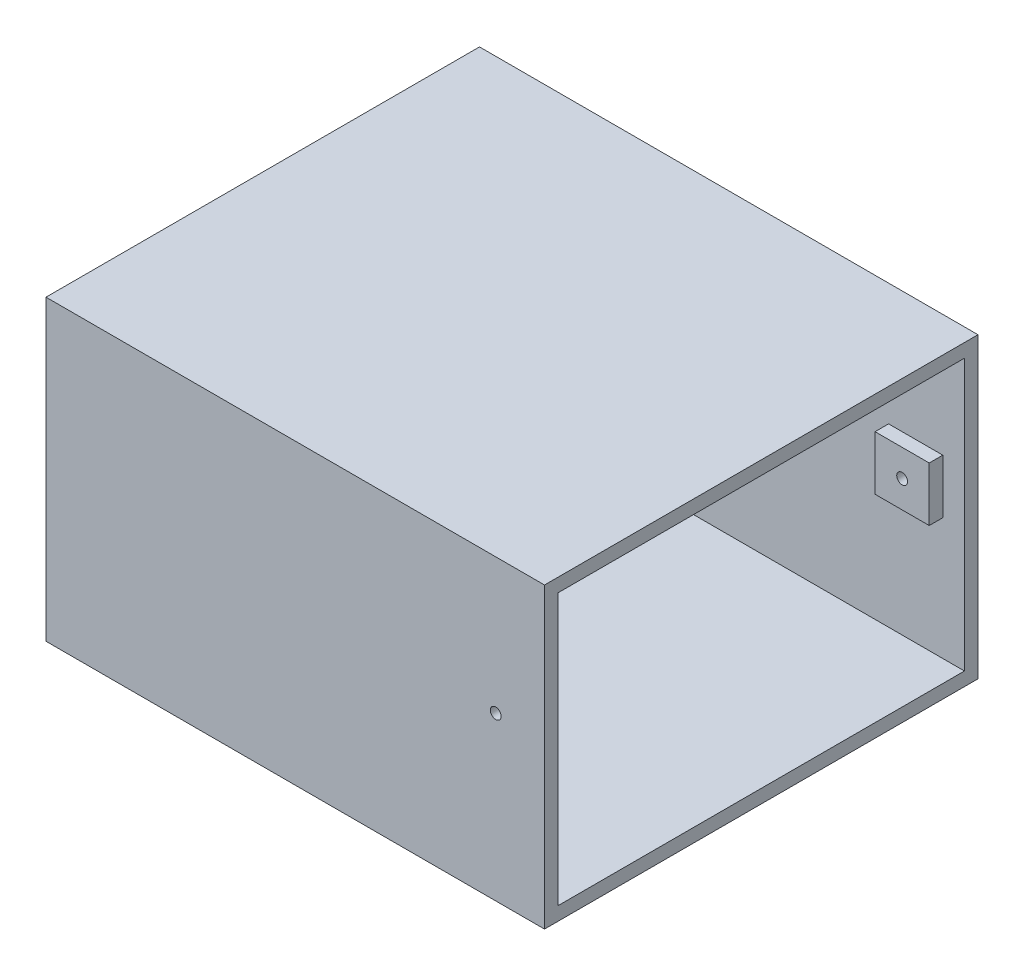
ISO-10303-21;
HEADER;
FILE_DESCRIPTION(('STEP AP214'),'2;1');
FILE_NAME('part.step','',(''),(''),'','','');
FILE_SCHEMA(('AUTOMOTIVE_DESIGN { 1 0 10303 214 1 1 1 1 }'));
ENDSEC;
DATA;
#1=APPLICATION_CONTEXT('core data for automotive mechanical design processes');
#2=APPLICATION_PROTOCOL_DEFINITION('international standard','automotive_design',2000,#1);
#3=PRODUCT_CONTEXT('',#1,'mechanical');
#4=PRODUCT('Part','Part','',(#3));
#5=PRODUCT_RELATED_PRODUCT_CATEGORY('part','',(#4));
#6=PRODUCT_DEFINITION_FORMATION('','',#4);
#7=PRODUCT_DEFINITION_CONTEXT('part definition',#1,'design');
#8=PRODUCT_DEFINITION('design','',#6,#7);
#9=PRODUCT_DEFINITION_SHAPE('','',#8);
#10=(LENGTH_UNIT() NAMED_UNIT(*) SI_UNIT(.MILLI.,.METRE.));
#11=(NAMED_UNIT(*) PLANE_ANGLE_UNIT() SI_UNIT($,.RADIAN.));
#12=(NAMED_UNIT(*) SI_UNIT($,.STERADIAN.) SOLID_ANGLE_UNIT());
#13=UNCERTAINTY_MEASURE_WITH_UNIT(LENGTH_MEASURE(1.E-05),#10,'distance_accuracy_value','');
#14=(GEOMETRIC_REPRESENTATION_CONTEXT(3) GLOBAL_UNCERTAINTY_ASSIGNED_CONTEXT((#13)) GLOBAL_UNIT_ASSIGNED_CONTEXT((#10,
#11,#12)) REPRESENTATION_CONTEXT('',''));
#15=CARTESIAN_POINT('',(0.,0.,0.));
#16=DIRECTION('',(0.,0.,1.));
#17=DIRECTION('',(1.,0.,0.));
#18=AXIS2_PLACEMENT_3D('',#15,#16,#17);
#19=CARTESIAN_POINT('',(-89.5,-25.,37.5));
#20=DIRECTION('',(0.,0.,1.));
#21=DIRECTION('',(1.,0.,0.));
#22=AXIS2_PLACEMENT_3D('',#19,#20,#21);
#23=PLANE('',#22);
#24=DIRECTION('',(0.,-1.,0.));
#25=VECTOR('',#24,1.);
#26=CARTESIAN_POINT('',(0.,-25.,37.5));
#27=LINE('',#26,#25);
#28=CARTESIAN_POINT('',(0.,25.,37.5));
#29=VERTEX_POINT('',#28);
#30=CARTESIAN_POINT('',(0.,-25.,37.5));
#31=VERTEX_POINT('',#30);
#32=EDGE_CURVE('E305',#29,#31,#27,.T.);
#33=ORIENTED_EDGE('',*,*,#32,.T.);
#34=DIRECTION('',(1.,0.,0.));
#35=VECTOR('',#34,1.);
#36=CARTESIAN_POINT('',(-89.5,-25.,37.5));
#37=LINE('',#36,#35);
#38=CARTESIAN_POINT('',(-89.5,-25.,37.5));
#39=VERTEX_POINT('',#38);
#40=EDGE_CURVE('E314',#39,#31,#37,.T.);
#41=ORIENTED_EDGE('',*,*,#40,.F.);
#42=DIRECTION('',(0.,-1.,0.));
#43=VECTOR('',#42,1.);
#44=CARTESIAN_POINT('',(-89.5,-25.,37.5));
#45=LINE('',#44,#43);
#46=CARTESIAN_POINT('',(-89.5,25.,37.5));
#47=VERTEX_POINT('',#46);
#48=EDGE_CURVE('E294',#47,#39,#45,.T.);
#49=ORIENTED_EDGE('',*,*,#48,.F.);
#50=DIRECTION('',(1.,0.,0.));
#51=VECTOR('',#50,1.);
#52=CARTESIAN_POINT('',(-89.5,25.,37.5));
#53=LINE('',#52,#51);
#54=EDGE_CURVE('E316',#47,#29,#53,.T.);
#55=ORIENTED_EDGE('',*,*,#54,.T.);
#56=EDGE_LOOP('',(#33,#41,#49,#55));
#57=FACE_BOUND('',#56,.T.);
#58=DIRECTION('',(0.,1.,0.));
#59=VECTOR('',#58,1.);
#60=CARTESIAN_POINT('',(-14.,-2.50000000000001,37.5));
#61=LINE('',#60,#59);
#62=CARTESIAN_POINT('',(-14.,-2.50000000000001,37.5));
#63=VERTEX_POINT('',#62);
#64=CARTESIAN_POINT('',(-14.,7.49999999999999,37.5));
#65=VERTEX_POINT('',#64);
#66=EDGE_CURVE('E223',#63,#65,#61,.T.);
#67=ORIENTED_EDGE('',*,*,#66,.F.);
#68=DIRECTION('',(-1.,0.,0.));
#69=VECTOR('',#68,1.);
#70=CARTESIAN_POINT('',(-4.,-2.50000000000001,37.5));
#71=LINE('',#70,#69);
#72=CARTESIAN_POINT('',(-4.,-2.50000000000001,37.5));
#73=VERTEX_POINT('',#72);
#74=EDGE_CURVE('E228',#73,#63,#71,.T.);
#75=ORIENTED_EDGE('',*,*,#74,.F.);
#76=DIRECTION('',(0.,-1.,0.));
#77=VECTOR('',#76,1.);
#78=CARTESIAN_POINT('',(-4.,-2.50000000000001,37.5));
#79=LINE('',#78,#77);
#80=CARTESIAN_POINT('',(-4.,7.49999999999999,37.5));
#81=VERTEX_POINT('',#80);
#82=EDGE_CURVE('E238',#81,#73,#79,.T.);
#83=ORIENTED_EDGE('',*,*,#82,.F.);
#84=DIRECTION('',(1.,0.,0.));
#85=VECTOR('',#84,1.);
#86=CARTESIAN_POINT('',(-4.,7.49999999999999,37.5));
#87=LINE('',#86,#85);
#88=EDGE_CURVE('E65',#65,#81,#87,.T.);
#89=ORIENTED_EDGE('',*,*,#88,.F.);
#90=EDGE_LOOP('',(#67,#75,#83,#89));
#91=FACE_BOUND('',#90,.T.);
#92=ADVANCED_FACE('F40',(#57,#91),#23,.F.);
#93=CARTESIAN_POINT('',(-89.5,0.,0.));
#94=DIRECTION('',(-1.,0.,0.));
#95=DIRECTION('',(0.,0.,1.));
#96=AXIS2_PLACEMENT_3D('',#93,#94,#95);
#97=PLANE('',#96);
#98=DIRECTION('',(0.,0.,1.));
#99=VECTOR('',#98,1.);
#100=CARTESIAN_POINT('',(-89.5,16.5,-37.5));
#101=LINE('',#100,#99);
#102=CARTESIAN_POINT('',(-89.5,16.5,-37.5));
#103=VERTEX_POINT('',#102);
#104=CARTESIAN_POINT('',(-89.5,16.5,-2.5));
#105=VERTEX_POINT('',#104);
#106=EDGE_CURVE('E263',#103,#105,#101,.T.);
#107=ORIENTED_EDGE('',*,*,#106,.F.);
#108=DIRECTION('',(0.,1.,0.));
#109=VECTOR('',#108,1.);
#110=CARTESIAN_POINT('',(-89.5,-25.,-37.5));
#111=LINE('',#110,#109);
#112=CARTESIAN_POINT('',(-89.5,25.,-37.5));
#113=VERTEX_POINT('',#112);
#114=EDGE_CURVE('E291',#103,#113,#111,.T.);
#115=ORIENTED_EDGE('',*,*,#114,.T.);
#116=DIRECTION('',(0.,0.,1.));
#117=VECTOR('',#116,1.);
#118=CARTESIAN_POINT('',(-89.5,25.,37.5));
#119=LINE('',#118,#117);
#120=EDGE_CURVE('E290',#113,#47,#119,.T.);
#121=ORIENTED_EDGE('',*,*,#120,.T.);
#122=ORIENTED_EDGE('',*,*,#48,.T.);
#123=DIRECTION('',(0.,0.,-1.));
#124=VECTOR('',#123,1.);
#125=CARTESIAN_POINT('',(-89.5,-25.,37.5));
#126=LINE('',#125,#124);
#127=CARTESIAN_POINT('',(-89.5,-25.,-37.5));
#128=VERTEX_POINT('',#127);
#129=EDGE_CURVE('E297',#39,#128,#126,.T.);
#130=ORIENTED_EDGE('',*,*,#129,.T.);
#131=CARTESIAN_POINT('',(-89.5,1.5,-37.5));
#132=VERTEX_POINT('',#131);
#133=EDGE_CURVE('E287',#128,#132,#111,.T.);
#134=ORIENTED_EDGE('',*,*,#133,.T.);
#135=DIRECTION('',(0.,0.,-1.));
#136=VECTOR('',#135,1.);
#137=CARTESIAN_POINT('',(-89.5,1.5,-37.5));
#138=LINE('',#137,#136);
#139=CARTESIAN_POINT('',(-89.5,1.5,-2.5));
#140=VERTEX_POINT('',#139);
#141=EDGE_CURVE('E266',#140,#132,#138,.T.);
#142=ORIENTED_EDGE('',*,*,#141,.F.);
#143=DIRECTION('',(0.,-1.,0.));
#144=VECTOR('',#143,1.);
#145=CARTESIAN_POINT('',(-89.5,16.5,-2.5));
#146=LINE('',#145,#144);
#147=EDGE_CURVE('E260',#105,#140,#146,.T.);
#148=ORIENTED_EDGE('',*,*,#147,.F.);
#149=EDGE_LOOP('',(#107,#115,#121,#122,#130,#134,#142,#148));
#150=FACE_BOUND('',#149,.T.);
#151=ADVANCED_FACE('F373',(#150),#97,.F.);
#152=CARTESIAN_POINT('',(-92.,-27.5,-40.));
#153=DIRECTION('',(0.,0.,-1.));
#154=DIRECTION('',(-1.,0.,0.));
#155=AXIS2_PLACEMENT_3D('',#152,#153,#154);
#156=PLANE('',#155);
#157=CARTESIAN_POINT('',(-9.,2.5,-40.));
#158=DIRECTION('',(0.,0.,1.));
#159=DIRECTION('',(1.,0.,0.));
#160=AXIS2_PLACEMENT_3D('',#157,#158,#159);
#161=CIRCLE('',#160,1.);
#162=CARTESIAN_POINT('',(-8.,2.5,-40.));
#163=VERTEX_POINT('',#162);
#164=EDGE_CURVE('E254',#163,#163,#161,.T.);
#165=ORIENTED_EDGE('',*,*,#164,.T.);
#166=EDGE_LOOP('',(#165));
#167=FACE_BOUND('',#166,.T.);
#168=DIRECTION('',(0.,1.,0.));
#169=VECTOR('',#168,1.);
#170=CARTESIAN_POINT('',(0.,-27.5,-40.));
#171=LINE('',#170,#169);
#172=CARTESIAN_POINT('',(0.,-27.5,-40.));
#173=VERTEX_POINT('',#172);
#174=CARTESIAN_POINT('',(0.,27.5,-40.));
#175=VERTEX_POINT('',#174);
#176=EDGE_CURVE('E313',#173,#175,#171,.T.);
#177=ORIENTED_EDGE('',*,*,#176,.F.);
#178=DIRECTION('',(1.,0.,0.));
#179=VECTOR('',#178,1.);
#180=CARTESIAN_POINT('',(-92.,-27.5,-40.));
#181=LINE('',#180,#179);
#182=CARTESIAN_POINT('',(-92.,-27.5,-40.));
#183=VERTEX_POINT('',#182);
#184=EDGE_CURVE('E11',#183,#173,#181,.T.);
#185=ORIENTED_EDGE('',*,*,#184,.F.);
#186=DIRECTION('',(0.,1.,0.));
#187=VECTOR('',#186,1.);
#188=CARTESIAN_POINT('',(-92.,-27.5,-40.));
#189=LINE('',#188,#187);
#190=CARTESIAN_POINT('',(-92.,27.5,-40.));
#191=VERTEX_POINT('',#190);
#192=EDGE_CURVE('E320',#183,#191,#189,.T.);
#193=ORIENTED_EDGE('',*,*,#192,.T.);
#194=DIRECTION('',(1.,0.,0.));
#195=VECTOR('',#194,1.);
#196=CARTESIAN_POINT('',(-92.,27.5,-40.));
#197=LINE('',#196,#195);
#198=EDGE_CURVE('E44',#191,#175,#197,.T.);
#199=ORIENTED_EDGE('',*,*,#198,.T.);
#200=EDGE_LOOP('',(#177,#185,#193,#199));
#201=FACE_BOUND('',#200,.T.);
#202=ADVANCED_FACE('F42',(#167,#201),#156,.T.);
#203=CARTESIAN_POINT('',(-92.,-27.5,40.));
#204=DIRECTION('',(0.,-1.,0.));
#205=DIRECTION('',(0.,0.,-1.));
#206=AXIS2_PLACEMENT_3D('',#203,#204,#205);
#207=PLANE('',#206);
#208=DIRECTION('',(0.,0.,-1.));
#209=VECTOR('',#208,1.);
#210=CARTESIAN_POINT('',(0.,-27.5,40.));
#211=LINE('',#210,#209);
#212=CARTESIAN_POINT('',(0.,-27.5,40.));
#213=VERTEX_POINT('',#212);
#214=EDGE_CURVE('E324',#213,#173,#211,.T.);
#215=ORIENTED_EDGE('',*,*,#214,.F.);
#216=DIRECTION('',(1.,0.,0.));
#217=VECTOR('',#216,1.);
#218=CARTESIAN_POINT('',(-92.,-27.5,40.));
#219=LINE('',#218,#217);
#220=CARTESIAN_POINT('',(-92.,-27.5,40.));
#221=VERTEX_POINT('',#220);
#222=EDGE_CURVE('E49',#221,#213,#219,.T.);
#223=ORIENTED_EDGE('',*,*,#222,.F.);
#224=DIRECTION('',(0.,0.,-1.));
#225=VECTOR('',#224,1.);
#226=CARTESIAN_POINT('',(-92.,-27.5,40.));
#227=LINE('',#226,#225);
#228=EDGE_CURVE('E330',#221,#183,#227,.T.);
#229=ORIENTED_EDGE('',*,*,#228,.T.);
#230=ORIENTED_EDGE('',*,*,#184,.T.);
#231=EDGE_LOOP('',(#215,#223,#229,#230));
#232=FACE_BOUND('',#231,.T.);
#233=ADVANCED_FACE('F356',(#232),#207,.T.);
#234=CARTESIAN_POINT('',(-92.,-27.5,40.));
#235=DIRECTION('',(0.,0.,1.));
#236=DIRECTION('',(1.,0.,0.));
#237=AXIS2_PLACEMENT_3D('',#234,#235,#236);
#238=PLANE('',#237);
#239=CARTESIAN_POINT('',(-9.,2.5,40.));
#240=DIRECTION('',(0.,0.,1.));
#241=DIRECTION('',(1.,0.,0.));
#242=AXIS2_PLACEMENT_3D('',#239,#240,#241);
#243=CIRCLE('',#242,1.);
#244=CARTESIAN_POINT('',(-8.,2.5,40.));
#245=VERTEX_POINT('',#244);
#246=EDGE_CURVE('E253',#245,#245,#243,.T.);
#247=ORIENTED_EDGE('',*,*,#246,.F.);
#248=EDGE_LOOP('',(#247));
#249=FACE_BOUND('',#248,.T.);
#250=DIRECTION('',(0.,-1.,0.));
#251=VECTOR('',#250,1.);
#252=CARTESIAN_POINT('',(0.,-27.5,40.));
#253=LINE('',#252,#251);
#254=CARTESIAN_POINT('',(0.,27.5,40.));
#255=VERTEX_POINT('',#254);
#256=EDGE_CURVE('E338',#255,#213,#253,.T.);
#257=ORIENTED_EDGE('',*,*,#256,.F.);
#258=DIRECTION('',(1.,0.,0.));
#259=VECTOR('',#258,1.);
#260=CARTESIAN_POINT('',(-92.,27.5,40.));
#261=LINE('',#260,#259);
#262=CARTESIAN_POINT('',(-92.,27.5,40.));
#263=VERTEX_POINT('',#262);
#264=EDGE_CURVE('E343',#263,#255,#261,.T.);
#265=ORIENTED_EDGE('',*,*,#264,.F.);
#266=DIRECTION('',(0.,-1.,0.));
#267=VECTOR('',#266,1.);
#268=CARTESIAN_POINT('',(-92.,-27.5,40.));
#269=LINE('',#268,#267);
#270=EDGE_CURVE('E327',#263,#221,#269,.T.);
#271=ORIENTED_EDGE('',*,*,#270,.T.);
#272=ORIENTED_EDGE('',*,*,#222,.T.);
#273=EDGE_LOOP('',(#257,#265,#271,#272));
#274=FACE_BOUND('',#273,.T.);
#275=ADVANCED_FACE('F362',(#249,#274),#238,.T.);
#276=CARTESIAN_POINT('',(-92.,27.5,40.));
#277=DIRECTION('',(0.,1.,0.));
#278=DIRECTION('',(0.,0.,1.));
#279=AXIS2_PLACEMENT_3D('',#276,#277,#278);
#280=PLANE('',#279);
#281=DIRECTION('',(0.,0.,1.));
#282=VECTOR('',#281,1.);
#283=CARTESIAN_POINT('',(0.,27.5,40.));
#284=LINE('',#283,#282);
#285=EDGE_CURVE('E335',#175,#255,#284,.T.);
#286=ORIENTED_EDGE('',*,*,#285,.F.);
#287=ORIENTED_EDGE('',*,*,#198,.F.);
#288=DIRECTION('',(0.,0.,1.));
#289=VECTOR('',#288,1.);
#290=CARTESIAN_POINT('',(-92.,27.5,40.));
#291=LINE('',#290,#289);
#292=EDGE_CURVE('E323',#191,#263,#291,.T.);
#293=ORIENTED_EDGE('',*,*,#292,.T.);
#294=ORIENTED_EDGE('',*,*,#264,.T.);
#295=EDGE_LOOP('',(#286,#287,#293,#294));
#296=FACE_BOUND('',#295,.T.);
#297=ADVANCED_FACE('F351',(#296),#280,.T.);
#298=CARTESIAN_POINT('',(-92.,0.,0.));
#299=DIRECTION('',(-1.,0.,0.));
#300=DIRECTION('',(0.,0.,1.));
#301=AXIS2_PLACEMENT_3D('',#298,#299,#300);
#302=PLANE('',#301);
#303=DIRECTION('',(0.,-1.,0.));
#304=VECTOR('',#303,1.);
#305=CARTESIAN_POINT('',(-92.,16.5,-37.5));
#306=LINE('',#305,#304);
#307=CARTESIAN_POINT('',(-92.,16.5,-37.5));
#308=VERTEX_POINT('',#307);
#309=CARTESIAN_POINT('',(-92.,1.5,-37.5));
#310=VERTEX_POINT('',#309);
#311=EDGE_CURVE('E257',#308,#310,#306,.T.);
#312=ORIENTED_EDGE('',*,*,#311,.F.);
#313=DIRECTION('',(0.,0.,-1.));
#314=VECTOR('',#313,1.);
#315=CARTESIAN_POINT('',(-92.,16.5,-37.5));
#316=LINE('',#315,#314);
#317=CARTESIAN_POINT('',(-92.,16.5,-2.5));
#318=VERTEX_POINT('',#317);
#319=EDGE_CURVE('E274',#318,#308,#316,.T.);
#320=ORIENTED_EDGE('',*,*,#319,.F.);
#321=DIRECTION('',(0.,1.,0.));
#322=VECTOR('',#321,1.);
#323=CARTESIAN_POINT('',(-92.,16.5,-2.5));
#324=LINE('',#323,#322);
#325=CARTESIAN_POINT('',(-92.,1.5,-2.5));
#326=VERTEX_POINT('',#325);
#327=EDGE_CURVE('E271',#326,#318,#324,.T.);
#328=ORIENTED_EDGE('',*,*,#327,.F.);
#329=DIRECTION('',(0.,0.,1.));
#330=VECTOR('',#329,1.);
#331=CARTESIAN_POINT('',(-92.,1.5,-37.5));
#332=LINE('',#331,#330);
#333=EDGE_CURVE('E268',#310,#326,#332,.T.);
#334=ORIENTED_EDGE('',*,*,#333,.F.);
#335=EDGE_LOOP('',(#312,#320,#328,#334));
#336=FACE_BOUND('',#335,.T.);
#337=ORIENTED_EDGE('',*,*,#192,.F.);
#338=ORIENTED_EDGE('',*,*,#228,.F.);
#339=ORIENTED_EDGE('',*,*,#270,.F.);
#340=ORIENTED_EDGE('',*,*,#292,.F.);
#341=EDGE_LOOP('',(#337,#338,#339,#340));
#342=FACE_BOUND('',#341,.T.);
#343=ADVANCED_FACE('F359',(#336,#342),#302,.T.);
#344=CARTESIAN_POINT('',(0.,0.,0.));
#345=DIRECTION('',(-1.,0.,0.));
#346=DIRECTION('',(0.,0.,1.));
#347=AXIS2_PLACEMENT_3D('',#344,#345,#346);
#348=PLANE('',#347);
#349=DIRECTION('',(0.,0.,1.));
#350=VECTOR('',#349,1.);
#351=CARTESIAN_POINT('',(0.,25.,37.5));
#352=LINE('',#351,#350);
#353=CARTESIAN_POINT('',(0.,25.,-37.5));
#354=VERTEX_POINT('',#353);
#355=EDGE_CURVE('E302',#354,#29,#352,.T.);
#356=ORIENTED_EDGE('',*,*,#355,.F.);
#357=DIRECTION('',(0.,1.,0.));
#358=VECTOR('',#357,1.);
#359=CARTESIAN_POINT('',(0.,-25.,-37.5));
#360=LINE('',#359,#358);
#361=CARTESIAN_POINT('',(0.,-25.,-37.5));
#362=VERTEX_POINT('',#361);
#363=EDGE_CURVE('E286',#362,#354,#360,.T.);
#364=ORIENTED_EDGE('',*,*,#363,.F.);
#365=DIRECTION('',(0.,0.,-1.));
#366=VECTOR('',#365,1.);
#367=CARTESIAN_POINT('',(0.,-25.,37.5));
#368=LINE('',#367,#366);
#369=EDGE_CURVE('E308',#31,#362,#368,.T.);
#370=ORIENTED_EDGE('',*,*,#369,.F.);
#371=ORIENTED_EDGE('',*,*,#32,.F.);
#372=EDGE_LOOP('',(#356,#364,#370,#371));
#373=FACE_BOUND('',#372,.T.);
#374=ORIENTED_EDGE('',*,*,#176,.T.);
#375=ORIENTED_EDGE('',*,*,#285,.T.);
#376=ORIENTED_EDGE('',*,*,#256,.T.);
#377=ORIENTED_EDGE('',*,*,#214,.T.);
#378=EDGE_LOOP('',(#374,#375,#376,#377));
#379=FACE_BOUND('',#378,.T.);
#380=ADVANCED_FACE('F353',(#373,#379),#348,.F.);
#381=CARTESIAN_POINT('',(-89.5,-25.,-37.5));
#382=DIRECTION('',(0.,0.,-1.));
#383=DIRECTION('',(-1.,0.,0.));
#384=AXIS2_PLACEMENT_3D('',#381,#382,#383);
#385=PLANE('',#384);
#386=DIRECTION('',(-1.,0.,0.));
#387=VECTOR('',#386,1.);
#388=CARTESIAN_POINT('',(-4.,-2.50000000000001,-37.5));
#389=LINE('',#388,#387);
#390=CARTESIAN_POINT('',(-4.,-2.50000000000001,-37.5));
#391=VERTEX_POINT('',#390);
#392=CARTESIAN_POINT('',(-14.,-2.50000000000001,-37.5));
#393=VERTEX_POINT('',#392);
#394=EDGE_CURVE('E211',#391,#393,#389,.T.);
#395=ORIENTED_EDGE('',*,*,#394,.T.);
#396=DIRECTION('',(0.,1.,0.));
#397=VECTOR('',#396,1.);
#398=CARTESIAN_POINT('',(-14.,-2.50000000000001,-37.5));
#399=LINE('',#398,#397);
#400=CARTESIAN_POINT('',(-14.,7.49999999999999,-37.5));
#401=VERTEX_POINT('',#400);
#402=EDGE_CURVE('E184',#393,#401,#399,.T.);
#403=ORIENTED_EDGE('',*,*,#402,.T.);
#404=DIRECTION('',(1.,0.,0.));
#405=VECTOR('',#404,1.);
#406=CARTESIAN_POINT('',(-4.,7.49999999999999,-37.5));
#407=LINE('',#406,#405);
#408=CARTESIAN_POINT('',(-4.,7.49999999999999,-37.5));
#409=VERTEX_POINT('',#408);
#410=EDGE_CURVE('E200',#401,#409,#407,.T.);
#411=ORIENTED_EDGE('',*,*,#410,.T.);
#412=DIRECTION('',(0.,-1.,0.));
#413=VECTOR('',#412,1.);
#414=CARTESIAN_POINT('',(-4.,-2.50000000000001,-37.5));
#415=LINE('',#414,#413);
#416=EDGE_CURVE('E57',#409,#391,#415,.T.);
#417=ORIENTED_EDGE('',*,*,#416,.T.);
#418=EDGE_LOOP('',(#395,#403,#411,#417));
#419=FACE_BOUND('',#418,.T.);
#420=ORIENTED_EDGE('',*,*,#363,.T.);
#421=DIRECTION('',(1.,0.,0.));
#422=VECTOR('',#421,1.);
#423=CARTESIAN_POINT('',(-89.5,25.,-37.5));
#424=LINE('',#423,#422);
#425=EDGE_CURVE('E300',#113,#354,#424,.T.);
#426=ORIENTED_EDGE('',*,*,#425,.F.);
#427=ORIENTED_EDGE('',*,*,#114,.F.);
#428=DIRECTION('',(-1.,0.,0.));
#429=VECTOR('',#428,1.);
#430=CARTESIAN_POINT('',(-51.4211344706805,16.5,-37.5));
#431=LINE('',#430,#429);
#432=EDGE_CURVE('E264',#103,#308,#431,.T.);
#433=ORIENTED_EDGE('',*,*,#432,.T.);
#434=ORIENTED_EDGE('',*,*,#311,.T.);
#435=DIRECTION('',(-1.,0.,0.));
#436=VECTOR('',#435,1.);
#437=CARTESIAN_POINT('',(-51.4211344706805,1.5,-37.5));
#438=LINE('',#437,#436);
#439=EDGE_CURVE('E277',#132,#310,#438,.T.);
#440=ORIENTED_EDGE('',*,*,#439,.F.);
#441=ORIENTED_EDGE('',*,*,#133,.F.);
#442=DIRECTION('',(1.,0.,0.));
#443=VECTOR('',#442,1.);
#444=CARTESIAN_POINT('',(-89.5,-25.,-37.5));
#445=LINE('',#444,#443);
#446=EDGE_CURVE('E311',#128,#362,#445,.T.);
#447=ORIENTED_EDGE('',*,*,#446,.T.);
#448=EDGE_LOOP('',(#420,#426,#427,#433,#434,#440,#441,#447));
#449=FACE_BOUND('',#448,.T.);
#450=ADVANCED_FACE('F390',(#419,#449),#385,.F.);
#451=CARTESIAN_POINT('',(-89.5,-25.,37.5));
#452=DIRECTION('',(0.,-1.,0.));
#453=DIRECTION('',(0.,0.,-1.));
#454=AXIS2_PLACEMENT_3D('',#451,#452,#453);
#455=PLANE('',#454);
#456=ORIENTED_EDGE('',*,*,#369,.T.);
#457=ORIENTED_EDGE('',*,*,#446,.F.);
#458=ORIENTED_EDGE('',*,*,#129,.F.);
#459=ORIENTED_EDGE('',*,*,#40,.T.);
#460=EDGE_LOOP('',(#456,#457,#458,#459));
#461=FACE_BOUND('',#460,.T.);
#462=ADVANCED_FACE('F384',(#461),#455,.F.);
#463=CARTESIAN_POINT('',(-89.5,25.,37.5));
#464=DIRECTION('',(0.,1.,0.));
#465=DIRECTION('',(0.,0.,1.));
#466=AXIS2_PLACEMENT_3D('',#463,#464,#465);
#467=PLANE('',#466);
#468=ORIENTED_EDGE('',*,*,#355,.T.);
#469=ORIENTED_EDGE('',*,*,#54,.F.);
#470=ORIENTED_EDGE('',*,*,#120,.F.);
#471=ORIENTED_EDGE('',*,*,#425,.T.);
#472=EDGE_LOOP('',(#468,#469,#470,#471));
#473=FACE_BOUND('',#472,.T.);
#474=ADVANCED_FACE('F385',(#473),#467,.F.);
#475=CARTESIAN_POINT('',(-51.4211344706805,16.5,-37.5));
#476=DIRECTION('',(0.,1.,0.));
#477=DIRECTION('',(0.,0.,1.));
#478=AXIS2_PLACEMENT_3D('',#475,#476,#477);
#479=PLANE('',#478);
#480=ORIENTED_EDGE('',*,*,#106,.T.);
#481=DIRECTION('',(-1.,0.,0.));
#482=VECTOR('',#481,1.);
#483=CARTESIAN_POINT('',(-51.4211344706805,16.5,-2.5));
#484=LINE('',#483,#482);
#485=EDGE_CURVE('E279',#105,#318,#484,.T.);
#486=ORIENTED_EDGE('',*,*,#485,.T.);
#487=ORIENTED_EDGE('',*,*,#319,.T.);
#488=ORIENTED_EDGE('',*,*,#432,.F.);
#489=EDGE_LOOP('',(#480,#486,#487,#488));
#490=FACE_BOUND('',#489,.T.);
#491=ADVANCED_FACE('F388',(#490),#479,.F.);
#492=CARTESIAN_POINT('',(-51.4211344706805,16.5,-2.5));
#493=DIRECTION('',(0.,0.,1.));
#494=DIRECTION('',(1.,0.,0.));
#495=AXIS2_PLACEMENT_3D('',#492,#493,#494);
#496=PLANE('',#495);
#497=ORIENTED_EDGE('',*,*,#147,.T.);
#498=DIRECTION('',(-1.,0.,0.));
#499=VECTOR('',#498,1.);
#500=CARTESIAN_POINT('',(-51.4211344706805,1.5,-2.5));
#501=LINE('',#500,#499);
#502=EDGE_CURVE('E281',#140,#326,#501,.T.);
#503=ORIENTED_EDGE('',*,*,#502,.T.);
#504=ORIENTED_EDGE('',*,*,#327,.T.);
#505=ORIENTED_EDGE('',*,*,#485,.F.);
#506=EDGE_LOOP('',(#497,#503,#504,#505));
#507=FACE_BOUND('',#506,.T.);
#508=ADVANCED_FACE('F422',(#507),#496,.F.);
#509=CARTESIAN_POINT('',(-51.4211344706805,1.5,-37.5));
#510=DIRECTION('',(0.,-1.,0.));
#511=DIRECTION('',(0.,0.,-1.));
#512=AXIS2_PLACEMENT_3D('',#509,#510,#511);
#513=PLANE('',#512);
#514=ORIENTED_EDGE('',*,*,#141,.T.);
#515=ORIENTED_EDGE('',*,*,#439,.T.);
#516=ORIENTED_EDGE('',*,*,#333,.T.);
#517=ORIENTED_EDGE('',*,*,#502,.F.);
#518=EDGE_LOOP('',(#514,#515,#516,#517));
#519=FACE_BOUND('',#518,.T.);
#520=ADVANCED_FACE('F428',(#519),#513,.F.);
#521=CARTESIAN_POINT('',(-9.,2.5,-40.));
#522=DIRECTION('',(0.,0.,1.));
#523=DIRECTION('',(1.,0.,0.));
#524=AXIS2_PLACEMENT_3D('',#521,#522,#523);
#525=CYLINDRICAL_SURFACE('',#524,1.);
#526=ORIENTED_EDGE('',*,*,#246,.T.);
#527=EDGE_LOOP('',(#526));
#528=FACE_BOUND('',#527,.T.);
#529=CARTESIAN_POINT('',(-9.,2.5,35.));
#530=DIRECTION('',(0.,0.,-1.));
#531=DIRECTION('',(-1.,0.,0.));
#532=AXIS2_PLACEMENT_3D('',#529,#530,#531);
#533=CIRCLE('',#532,1.);
#534=CARTESIAN_POINT('',(-10.,2.5,35.));
#535=VERTEX_POINT('',#534);
#536=EDGE_CURVE('E189',#535,#535,#533,.T.);
#537=ORIENTED_EDGE('',*,*,#536,.T.);
#538=EDGE_LOOP('',(#537));
#539=FACE_BOUND('',#538,.T.);
#540=ADVANCED_FACE('F430',(#528,#539),#525,.F.);
#541=ORIENTED_EDGE('',*,*,#164,.F.);
#542=EDGE_LOOP('',(#541));
#543=FACE_BOUND('',#542,.T.);
#544=CARTESIAN_POINT('',(-9.,2.5,-35.));
#545=DIRECTION('',(0.,0.,-1.));
#546=DIRECTION('',(-1.,0.,0.));
#547=AXIS2_PLACEMENT_3D('',#544,#545,#546);
#548=CIRCLE('',#547,1.);
#549=CARTESIAN_POINT('',(-10.,2.5,-35.));
#550=VERTEX_POINT('',#549);
#551=EDGE_CURVE('E212',#550,#550,#548,.T.);
#552=ORIENTED_EDGE('',*,*,#551,.F.);
#553=EDGE_LOOP('',(#552));
#554=FACE_BOUND('',#553,.T.);
#555=ADVANCED_FACE('F436',(#543,#554),#525,.F.);
#556=CARTESIAN_POINT('',(-14.,-2.50000000000001,35.));
#557=DIRECTION('',(1.,0.,0.));
#558=DIRECTION('',(0.,0.,-1.));
#559=AXIS2_PLACEMENT_3D('',#556,#557,#558);
#560=PLANE('',#559);
#561=ORIENTED_EDGE('',*,*,#66,.T.);
#562=DIRECTION('',(0.,0.,1.));
#563=VECTOR('',#562,1.);
#564=CARTESIAN_POINT('',(-14.,7.49999999999999,35.));
#565=LINE('',#564,#563);
#566=CARTESIAN_POINT('',(-14.,7.49999999999999,35.));
#567=VERTEX_POINT('',#566);
#568=EDGE_CURVE('E251',#567,#65,#565,.T.);
#569=ORIENTED_EDGE('',*,*,#568,.F.);
#570=DIRECTION('',(0.,1.,0.));
#571=VECTOR('',#570,1.);
#572=CARTESIAN_POINT('',(-14.,-2.50000000000001,35.));
#573=LINE('',#572,#571);
#574=CARTESIAN_POINT('',(-14.,-2.50000000000001,35.));
#575=VERTEX_POINT('',#574);
#576=EDGE_CURVE('E224',#575,#567,#573,.T.);
#577=ORIENTED_EDGE('',*,*,#576,.F.);
#578=DIRECTION('',(0.,0.,1.));
#579=VECTOR('',#578,1.);
#580=CARTESIAN_POINT('',(-14.,-2.50000000000001,35.));
#581=LINE('',#580,#579);
#582=EDGE_CURVE('E234',#575,#63,#581,.T.);
#583=ORIENTED_EDGE('',*,*,#582,.T.);
#584=EDGE_LOOP('',(#561,#569,#577,#583));
#585=FACE_BOUND('',#584,.T.);
#586=ADVANCED_FACE('F444',(#585),#560,.F.);
#587=CARTESIAN_POINT('',(-4.,7.49999999999999,35.));
#588=DIRECTION('',(0.,-1.,0.));
#589=DIRECTION('',(0.,0.,-1.));
#590=AXIS2_PLACEMENT_3D('',#587,#588,#589);
#591=PLANE('',#590);
#592=ORIENTED_EDGE('',*,*,#88,.T.);
#593=DIRECTION('',(0.,0.,1.));
#594=VECTOR('',#593,1.);
#595=CARTESIAN_POINT('',(-4.,7.49999999999999,35.));
#596=LINE('',#595,#594);
#597=CARTESIAN_POINT('',(-4.,7.49999999999999,35.));
#598=VERTEX_POINT('',#597);
#599=EDGE_CURVE('E248',#598,#81,#596,.T.);
#600=ORIENTED_EDGE('',*,*,#599,.F.);
#601=DIRECTION('',(1.,0.,0.));
#602=VECTOR('',#601,1.);
#603=CARTESIAN_POINT('',(-4.,7.49999999999999,35.));
#604=LINE('',#603,#602);
#605=EDGE_CURVE('E227',#567,#598,#604,.T.);
#606=ORIENTED_EDGE('',*,*,#605,.F.);
#607=ORIENTED_EDGE('',*,*,#568,.T.);
#608=EDGE_LOOP('',(#592,#600,#606,#607));
#609=FACE_BOUND('',#608,.T.);
#610=ADVANCED_FACE('F448',(#609),#591,.F.);
#611=CARTESIAN_POINT('',(-4.,-2.50000000000001,35.));
#612=DIRECTION('',(-1.,0.,0.));
#613=DIRECTION('',(0.,0.,1.));
#614=AXIS2_PLACEMENT_3D('',#611,#612,#613);
#615=PLANE('',#614);
#616=ORIENTED_EDGE('',*,*,#82,.T.);
#617=DIRECTION('',(0.,0.,1.));
#618=VECTOR('',#617,1.);
#619=CARTESIAN_POINT('',(-4.,-2.50000000000001,35.));
#620=LINE('',#619,#618);
#621=CARTESIAN_POINT('',(-4.,-2.50000000000001,35.));
#622=VERTEX_POINT('',#621);
#623=EDGE_CURVE('E245',#622,#73,#620,.T.);
#624=ORIENTED_EDGE('',*,*,#623,.F.);
#625=DIRECTION('',(0.,-1.,0.));
#626=VECTOR('',#625,1.);
#627=CARTESIAN_POINT('',(-4.,-2.50000000000001,35.));
#628=LINE('',#627,#626);
#629=EDGE_CURVE('E230',#598,#622,#628,.T.);
#630=ORIENTED_EDGE('',*,*,#629,.F.);
#631=ORIENTED_EDGE('',*,*,#599,.T.);
#632=EDGE_LOOP('',(#616,#624,#630,#631));
#633=FACE_BOUND('',#632,.T.);
#634=ADVANCED_FACE('F452',(#633),#615,.F.);
#635=CARTESIAN_POINT('',(-4.,-2.50000000000001,35.));
#636=DIRECTION('',(0.,1.,0.));
#637=DIRECTION('',(0.,0.,1.));
#638=AXIS2_PLACEMENT_3D('',#635,#636,#637);
#639=PLANE('',#638);
#640=ORIENTED_EDGE('',*,*,#74,.T.);
#641=ORIENTED_EDGE('',*,*,#582,.F.);
#642=DIRECTION('',(-1.,0.,0.));
#643=VECTOR('',#642,1.);
#644=CARTESIAN_POINT('',(-4.,-2.50000000000001,35.));
#645=LINE('',#644,#643);
#646=EDGE_CURVE('E232',#622,#575,#645,.T.);
#647=ORIENTED_EDGE('',*,*,#646,.F.);
#648=ORIENTED_EDGE('',*,*,#623,.T.);
#649=EDGE_LOOP('',(#640,#641,#647,#648));
#650=FACE_BOUND('',#649,.T.);
#651=ADVANCED_FACE('F456',(#650),#639,.F.);
#652=CARTESIAN_POINT('',(0.,0.,35.));
#653=DIRECTION('',(0.,0.,1.));
#654=DIRECTION('',(1.,0.,0.));
#655=AXIS2_PLACEMENT_3D('',#652,#653,#654);
#656=PLANE('',#655);
#657=ORIENTED_EDGE('',*,*,#536,.F.);
#658=EDGE_LOOP('',(#657));
#659=FACE_BOUND('',#658,.T.);
#660=ORIENTED_EDGE('',*,*,#576,.T.);
#661=ORIENTED_EDGE('',*,*,#605,.T.);
#662=ORIENTED_EDGE('',*,*,#629,.T.);
#663=ORIENTED_EDGE('',*,*,#646,.T.);
#664=EDGE_LOOP('',(#660,#661,#662,#663));
#665=FACE_BOUND('',#664,.T.);
#666=ADVANCED_FACE('F460',(#659,#665),#656,.F.);
#667=CARTESIAN_POINT('',(-14.,-2.50000000000001,-35.));
#668=DIRECTION('',(-1.,0.,0.));
#669=DIRECTION('',(0.,0.,1.));
#670=AXIS2_PLACEMENT_3D('',#667,#668,#669);
#671=PLANE('',#670);
#672=ORIENTED_EDGE('',*,*,#402,.F.);
#673=DIRECTION('',(0.,0.,-1.));
#674=VECTOR('',#673,1.);
#675=CARTESIAN_POINT('',(-14.,-2.50000000000001,-35.));
#676=LINE('',#675,#674);
#677=CARTESIAN_POINT('',(-14.,-2.50000000000001,-35.));
#678=VERTEX_POINT('',#677);
#679=EDGE_CURVE('E178',#678,#393,#676,.T.);
#680=ORIENTED_EDGE('',*,*,#679,.F.);
#681=DIRECTION('',(0.,1.,0.));
#682=VECTOR('',#681,1.);
#683=CARTESIAN_POINT('',(-14.,-2.50000000000001,-35.));
#684=LINE('',#683,#682);
#685=CARTESIAN_POINT('',(-14.,7.49999999999999,-35.));
#686=VERTEX_POINT('',#685);
#687=EDGE_CURVE('E181',#678,#686,#684,.T.);
#688=ORIENTED_EDGE('',*,*,#687,.T.);
#689=DIRECTION('',(0.,0.,-1.));
#690=VECTOR('',#689,1.);
#691=CARTESIAN_POINT('',(-14.,7.49999999999999,-35.));
#692=LINE('',#691,#690);
#693=EDGE_CURVE('E209',#686,#401,#692,.T.);
#694=ORIENTED_EDGE('',*,*,#693,.T.);
#695=EDGE_LOOP('',(#672,#680,#688,#694));
#696=FACE_BOUND('',#695,.T.);
#697=ADVANCED_FACE('F180',(#696),#671,.T.);
#698=CARTESIAN_POINT('',(-4.,-2.50000000000001,-35.));
#699=DIRECTION('',(0.,-1.,0.));
#700=DIRECTION('',(0.,0.,-1.));
#701=AXIS2_PLACEMENT_3D('',#698,#699,#700);
#702=PLANE('',#701);
#703=ORIENTED_EDGE('',*,*,#394,.F.);
#704=DIRECTION('',(0.,0.,-1.));
#705=VECTOR('',#704,1.);
#706=CARTESIAN_POINT('',(-4.,-2.50000000000001,-35.));
#707=LINE('',#706,#705);
#708=CARTESIAN_POINT('',(-4.,-2.50000000000001,-35.));
#709=VERTEX_POINT('',#708);
#710=EDGE_CURVE('E190',#709,#391,#707,.T.);
#711=ORIENTED_EDGE('',*,*,#710,.F.);
#712=DIRECTION('',(-1.,0.,0.));
#713=VECTOR('',#712,1.);
#714=CARTESIAN_POINT('',(-4.,-2.50000000000001,-35.));
#715=LINE('',#714,#713);
#716=EDGE_CURVE('E196',#709,#678,#715,.T.);
#717=ORIENTED_EDGE('',*,*,#716,.T.);
#718=ORIENTED_EDGE('',*,*,#679,.T.);
#719=EDGE_LOOP('',(#703,#711,#717,#718));
#720=FACE_BOUND('',#719,.T.);
#721=ADVANCED_FACE('F202',(#720),#702,.T.);
#722=CARTESIAN_POINT('',(-4.,-2.50000000000001,-35.));
#723=DIRECTION('',(1.,0.,0.));
#724=DIRECTION('',(0.,0.,-1.));
#725=AXIS2_PLACEMENT_3D('',#722,#723,#724);
#726=PLANE('',#725);
#727=ORIENTED_EDGE('',*,*,#416,.F.);
#728=DIRECTION('',(0.,0.,-1.));
#729=VECTOR('',#728,1.);
#730=CARTESIAN_POINT('',(-4.,7.49999999999999,-35.));
#731=LINE('',#730,#729);
#732=CARTESIAN_POINT('',(-4.,7.49999999999999,-35.));
#733=VERTEX_POINT('',#732);
#734=EDGE_CURVE('E218',#733,#409,#731,.T.);
#735=ORIENTED_EDGE('',*,*,#734,.F.);
#736=DIRECTION('',(0.,-1.,0.));
#737=VECTOR('',#736,1.);
#738=CARTESIAN_POINT('',(-4.,-2.50000000000001,-35.));
#739=LINE('',#738,#737);
#740=EDGE_CURVE('E203',#733,#709,#739,.T.);
#741=ORIENTED_EDGE('',*,*,#740,.T.);
#742=ORIENTED_EDGE('',*,*,#710,.T.);
#743=EDGE_LOOP('',(#727,#735,#741,#742));
#744=FACE_BOUND('',#743,.T.);
#745=ADVANCED_FACE('F469',(#744),#726,.T.);
#746=CARTESIAN_POINT('',(-4.,7.49999999999999,-35.));
#747=DIRECTION('',(0.,1.,0.));
#748=DIRECTION('',(0.,0.,1.));
#749=AXIS2_PLACEMENT_3D('',#746,#747,#748);
#750=PLANE('',#749);
#751=ORIENTED_EDGE('',*,*,#410,.F.);
#752=ORIENTED_EDGE('',*,*,#693,.F.);
#753=DIRECTION('',(1.,0.,0.));
#754=VECTOR('',#753,1.);
#755=CARTESIAN_POINT('',(-4.,7.49999999999999,-35.));
#756=LINE('',#755,#754);
#757=EDGE_CURVE('E199',#686,#733,#756,.T.);
#758=ORIENTED_EDGE('',*,*,#757,.T.);
#759=ORIENTED_EDGE('',*,*,#734,.T.);
#760=EDGE_LOOP('',(#751,#752,#758,#759));
#761=FACE_BOUND('',#760,.T.);
#762=ADVANCED_FACE('F472',(#761),#750,.T.);
#763=CARTESIAN_POINT('',(0.,0.,-35.));
#764=DIRECTION('',(0.,0.,-1.));
#765=DIRECTION('',(1.,0.,0.));
#766=AXIS2_PLACEMENT_3D('',#763,#764,#765);
#767=PLANE('',#766);
#768=ORIENTED_EDGE('',*,*,#551,.T.);
#769=EDGE_LOOP('',(#768));
#770=FACE_BOUND('',#769,.T.);
#771=ORIENTED_EDGE('',*,*,#687,.F.);
#772=ORIENTED_EDGE('',*,*,#716,.F.);
#773=ORIENTED_EDGE('',*,*,#740,.F.);
#774=ORIENTED_EDGE('',*,*,#757,.F.);
#775=EDGE_LOOP('',(#771,#772,#773,#774));
#776=FACE_BOUND('',#775,.T.);
#777=ADVANCED_FACE('F194',(#770,#776),#767,.F.);
#778=CLOSED_SHELL('',(#92,#151,#202,#233,#275,#297,#343,#380,#450,#462,#474,#491,#508,#520,#540,
#555,#586,#610,#634,#651,#666,#697,#721,#745,#762,#777));
#779=MANIFOLD_SOLID_BREP('B2',#778);
#780=ADVANCED_BREP_SHAPE_REPRESENTATION('',(#18,#779),#14);
#781=SHAPE_DEFINITION_REPRESENTATION(#9,#780);
ENDSEC;
END-ISO-10303-21;
